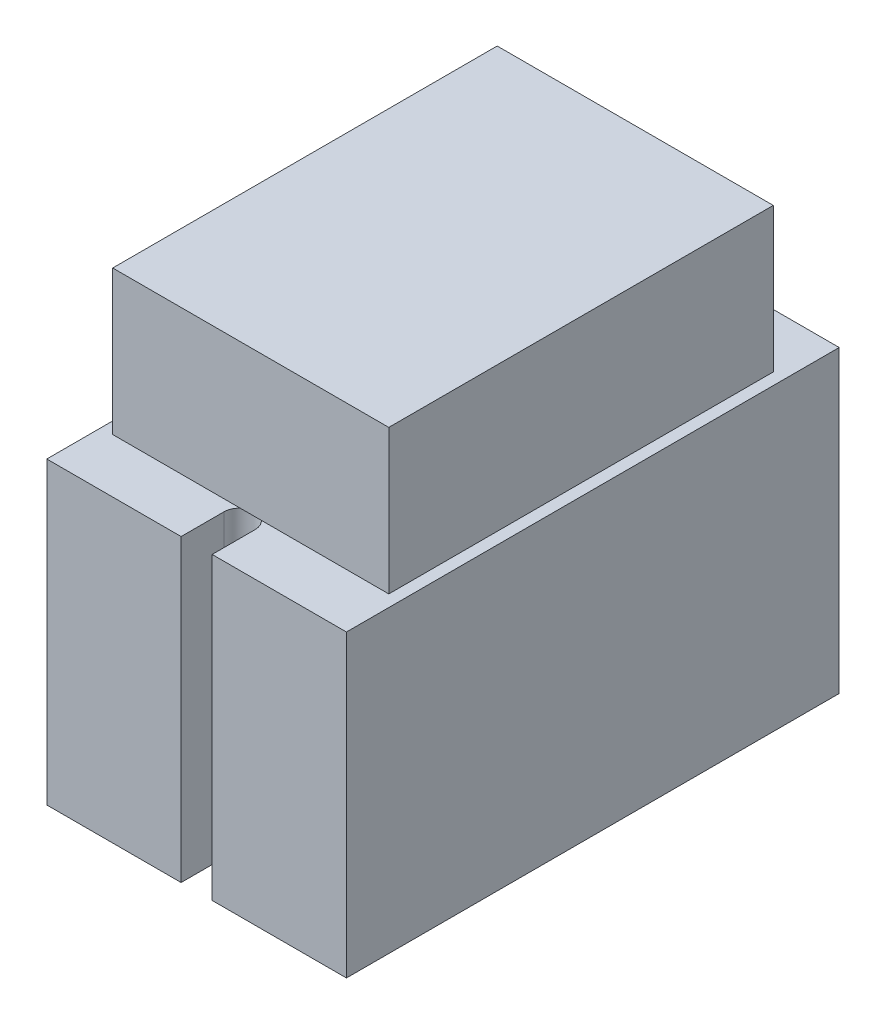
ISO-10303-21;
HEADER;
FILE_DESCRIPTION(('STEP AP214'),'2;1');
FILE_NAME('part.step','',(''),(''),'','','');
FILE_SCHEMA(('AUTOMOTIVE_DESIGN { 1 0 10303 214 1 1 1 1 }'));
ENDSEC;
DATA;
#1=APPLICATION_CONTEXT('core data for automotive mechanical design processes');
#2=APPLICATION_PROTOCOL_DEFINITION('international standard','automotive_design',2000,#1);
#3=PRODUCT_CONTEXT('',#1,'mechanical');
#4=PRODUCT('Part','Part','',(#3));
#5=PRODUCT_RELATED_PRODUCT_CATEGORY('part','',(#4));
#6=PRODUCT_DEFINITION_FORMATION('','',#4);
#7=PRODUCT_DEFINITION_CONTEXT('part definition',#1,'design');
#8=PRODUCT_DEFINITION('design','',#6,#7);
#9=PRODUCT_DEFINITION_SHAPE('','',#8);
#10=(LENGTH_UNIT() NAMED_UNIT(*) SI_UNIT(.MILLI.,.METRE.));
#11=(NAMED_UNIT(*) PLANE_ANGLE_UNIT() SI_UNIT($,.RADIAN.));
#12=(NAMED_UNIT(*) SI_UNIT($,.STERADIAN.) SOLID_ANGLE_UNIT());
#13=UNCERTAINTY_MEASURE_WITH_UNIT(LENGTH_MEASURE(1.E-05),#10,'distance_accuracy_value','');
#14=(GEOMETRIC_REPRESENTATION_CONTEXT(3) GLOBAL_UNCERTAINTY_ASSIGNED_CONTEXT((#13)) GLOBAL_UNIT_ASSIGNED_CONTEXT((#10,
#11,#12)) REPRESENTATION_CONTEXT('',''));
#15=CARTESIAN_POINT('',(0.,0.,0.));
#16=DIRECTION('',(0.,0.,1.));
#17=DIRECTION('',(1.,0.,0.));
#18=AXIS2_PLACEMENT_3D('',#15,#16,#17);
#19=CARTESIAN_POINT('',(0.,49.0728,0.));
#20=DIRECTION('',(0.,1.,0.));
#21=DIRECTION('',(0.,0.,1.));
#22=AXIS2_PLACEMENT_3D('',#19,#20,#21);
#23=PLANE('',#22);
#24=DIRECTION('',(1.,0.,0.));
#25=VECTOR('',#24,1.);
#26=CARTESIAN_POINT('',(1.9304,49.0728,-8.86459999999999));
#27=LINE('',#26,#25);
#28=CARTESIAN_POINT('',(26.2723557482839,49.0728,-8.86459999999999));
#29=VERTEX_POINT('',#28);
#30=CARTESIAN_POINT('',(47.1424,49.0728,-8.86459999999999));
#31=VERTEX_POINT('',#30);
#32=EDGE_CURVE('E11',#29,#31,#27,.T.);
#33=ORIENTED_EDGE('',*,*,#32,.F.);
#34=CARTESIAN_POINT('',(24.5364,49.0728,-7.0104));
#35=DIRECTION('',(0.,1.,0.));
#36=DIRECTION('',(0.,0.,1.));
#37=AXIS2_PLACEMENT_3D('',#34,#35,#36);
#38=CIRCLE('',#37,2.53999999999999);
#39=CARTESIAN_POINT('',(27.0764,49.0728,-7.0104));
#40=VERTEX_POINT('',#39);
#41=EDGE_CURVE('E193',#29,#40,#38,.F.);
#42=ORIENTED_EDGE('',*,*,#41,.T.);
#43=DIRECTION('',(0.,0.,1.));
#44=VECTOR('',#43,1.);
#45=CARTESIAN_POINT('',(27.0764,49.0728,0.));
#46=LINE('',#45,#44);
#47=CARTESIAN_POINT('',(27.0764,49.0728,0.));
#48=VERTEX_POINT('',#47);
#49=EDGE_CURVE('E198',#40,#48,#46,.T.);
#50=ORIENTED_EDGE('',*,*,#49,.T.);
#51=DIRECTION('',(1.,0.,0.));
#52=VECTOR('',#51,1.);
#53=CARTESIAN_POINT('',(0.,49.0728,0.));
#54=LINE('',#53,#52);
#55=CARTESIAN_POINT('',(49.0728,49.0728,0.));
#56=VERTEX_POINT('',#55);
#57=EDGE_CURVE('E201',#48,#56,#54,.T.);
#58=ORIENTED_EDGE('',*,*,#57,.T.);
#59=DIRECTION('',(0.,0.,-1.));
#60=VECTOR('',#59,1.);
#61=CARTESIAN_POINT('',(49.0728,49.0728,0.));
#62=LINE('',#61,#60);
#63=CARTESIAN_POINT('',(49.0728,49.0728,-80.6958));
#64=VERTEX_POINT('',#63);
#65=EDGE_CURVE('E203',#56,#64,#62,.T.);
#66=ORIENTED_EDGE('',*,*,#65,.T.);
#67=DIRECTION('',(1.,0.,0.));
#68=VECTOR('',#67,1.);
#69=CARTESIAN_POINT('',(0.,49.0728,-80.6958));
#70=LINE('',#69,#68);
#71=CARTESIAN_POINT('',(27.0764,49.0728,-80.6958));
#72=VERTEX_POINT('',#71);
#73=EDGE_CURVE('E206',#72,#64,#70,.T.);
#74=ORIENTED_EDGE('',*,*,#73,.F.);
#75=DIRECTION('',(0.,0.,-1.));
#76=VECTOR('',#75,1.);
#77=CARTESIAN_POINT('',(27.0764,49.0728,0.));
#78=LINE('',#77,#76);
#79=CARTESIAN_POINT('',(27.0764,49.0728,-73.6854));
#80=VERTEX_POINT('',#79);
#81=EDGE_CURVE('E209',#80,#72,#78,.T.);
#82=ORIENTED_EDGE('',*,*,#81,.F.);
#83=CARTESIAN_POINT('',(24.5364,49.0728,-73.6854));
#84=DIRECTION('',(0.,1.,0.));
#85=DIRECTION('',(0.,0.,1.));
#86=AXIS2_PLACEMENT_3D('',#83,#84,#85);
#87=CIRCLE('',#86,2.53999999999999);
#88=CARTESIAN_POINT('',(26.2723557482839,49.0728,-71.8312));
#89=VERTEX_POINT('',#88);
#90=EDGE_CURVE('E213',#89,#80,#87,.T.);
#91=ORIENTED_EDGE('',*,*,#90,.F.);
#92=DIRECTION('',(-1.,0.,0.));
#93=VECTOR('',#92,1.);
#94=CARTESIAN_POINT('',(1.93039999999999,49.0728,-71.8312));
#95=LINE('',#94,#93);
#96=CARTESIAN_POINT('',(47.1424,49.0728,-71.8312));
#97=VERTEX_POINT('',#96);
#98=EDGE_CURVE('E56',#97,#89,#95,.T.);
#99=ORIENTED_EDGE('',*,*,#98,.F.);
#100=DIRECTION('',(0.,0.,-1.));
#101=VECTOR('',#100,1.);
#102=CARTESIAN_POINT('',(47.1424,49.0728,-71.8312));
#103=LINE('',#102,#101);
#104=EDGE_CURVE('E52',#31,#97,#103,.T.);
#105=ORIENTED_EDGE('',*,*,#104,.F.);
#106=EDGE_LOOP('',(#33,#42,#50,#58,#66,#74,#82,#91,#99,#105));
#107=FACE_BOUND('',#106,.T.);
#108=ADVANCED_FACE('F33',(#107),#23,.T.);
#109=CARTESIAN_POINT('',(21.9964,49.0728,0.));
#110=DIRECTION('',(1.,0.,0.));
#111=DIRECTION('',(0.,0.,-1.));
#112=AXIS2_PLACEMENT_3D('',#109,#110,#111);
#113=PLANE('',#112);
#114=DIRECTION('',(0.,0.,1.));
#115=VECTOR('',#114,1.);
#116=CARTESIAN_POINT('',(21.9964,0.,0.));
#117=LINE('',#116,#115);
#118=CARTESIAN_POINT('',(21.9964,0.,-7.0104));
#119=VERTEX_POINT('',#118);
#120=CARTESIAN_POINT('',(21.9964,0.,0.));
#121=VERTEX_POINT('',#120);
#122=EDGE_CURVE('E181',#119,#121,#117,.T.);
#123=ORIENTED_EDGE('',*,*,#122,.F.);
#124=DIRECTION('',(0.,-1.,0.));
#125=VECTOR('',#124,1.);
#126=CARTESIAN_POINT('',(21.9964,49.0728,-7.0104));
#127=LINE('',#126,#125);
#128=CARTESIAN_POINT('',(21.9964,49.0728,-7.0104));
#129=VERTEX_POINT('',#128);
#130=EDGE_CURVE('E37',#129,#119,#127,.T.);
#131=ORIENTED_EDGE('',*,*,#130,.F.);
#132=DIRECTION('',(0.,0.,1.));
#133=VECTOR('',#132,1.);
#134=CARTESIAN_POINT('',(21.9964,49.0728,0.));
#135=LINE('',#134,#133);
#136=CARTESIAN_POINT('',(21.9964,49.0728,0.));
#137=VERTEX_POINT('',#136);
#138=EDGE_CURVE('E190',#129,#137,#135,.T.);
#139=ORIENTED_EDGE('',*,*,#138,.T.);
#140=DIRECTION('',(0.,-1.,0.));
#141=VECTOR('',#140,1.);
#142=CARTESIAN_POINT('',(21.9964,49.0728,0.));
#143=LINE('',#142,#141);
#144=EDGE_CURVE('E247',#137,#121,#143,.T.);
#145=ORIENTED_EDGE('',*,*,#144,.T.);
#146=EDGE_LOOP('',(#123,#131,#139,#145));
#147=FACE_BOUND('',#146,.T.);
#148=ADVANCED_FACE('F35',(#147),#113,.T.);
#149=CARTESIAN_POINT('',(24.5364,49.0728,-7.0104));
#150=DIRECTION('',(0.,-1.,0.));
#151=DIRECTION('',(0.,0.,-1.));
#152=AXIS2_PLACEMENT_3D('',#149,#150,#151);
#153=CYLINDRICAL_SURFACE('',#152,2.53999999999999);
#154=CARTESIAN_POINT('',(24.5364,0.,-7.0104));
#155=DIRECTION('',(0.,1.,0.));
#156=DIRECTION('',(0.,0.,1.));
#157=AXIS2_PLACEMENT_3D('',#154,#155,#156);
#158=CIRCLE('',#157,2.53999999999999);
#159=CARTESIAN_POINT('',(27.0764,0.,-7.0104));
#160=VERTEX_POINT('',#159);
#161=EDGE_CURVE('E184',#119,#160,#158,.F.);
#162=ORIENTED_EDGE('',*,*,#161,.T.);
#163=DIRECTION('',(0.,-1.,0.));
#164=VECTOR('',#163,1.);
#165=CARTESIAN_POINT('',(27.0764,49.0728,-7.0104));
#166=LINE('',#165,#164);
#167=EDGE_CURVE('E268',#40,#160,#166,.T.);
#168=ORIENTED_EDGE('',*,*,#167,.F.);
#169=ORIENTED_EDGE('',*,*,#41,.F.);
#170=CARTESIAN_POINT('',(22.8004442517161,49.0728,-8.86459999999999));
#171=VERTEX_POINT('',#170);
#172=EDGE_CURVE('E199',#171,#29,#38,.F.);
#173=ORIENTED_EDGE('',*,*,#172,.F.);
#174=EDGE_CURVE('E195',#129,#171,#38,.F.);
#175=ORIENTED_EDGE('',*,*,#174,.F.);
#176=ORIENTED_EDGE('',*,*,#130,.T.);
#177=EDGE_LOOP('',(#162,#168,#169,#173,#175,#176));
#178=FACE_BOUND('',#177,.T.);
#179=ADVANCED_FACE('F303',(#178),#153,.F.);
#180=CARTESIAN_POINT('',(27.0764,49.0728,0.));
#181=DIRECTION('',(1.,0.,0.));
#182=DIRECTION('',(0.,0.,-1.));
#183=AXIS2_PLACEMENT_3D('',#180,#181,#182);
#184=PLANE('',#183);
#185=DIRECTION('',(0.,0.,1.));
#186=VECTOR('',#185,1.);
#187=CARTESIAN_POINT('',(27.0764,0.,0.));
#188=LINE('',#187,#186);
#189=CARTESIAN_POINT('',(27.0764,0.,0.));
#190=VERTEX_POINT('',#189);
#191=EDGE_CURVE('E224',#160,#190,#188,.T.);
#192=ORIENTED_EDGE('',*,*,#191,.T.);
#193=DIRECTION('',(0.,-1.,0.));
#194=VECTOR('',#193,1.);
#195=CARTESIAN_POINT('',(27.0764,49.0728,0.));
#196=LINE('',#195,#194);
#197=EDGE_CURVE('E266',#48,#190,#196,.T.);
#198=ORIENTED_EDGE('',*,*,#197,.F.);
#199=ORIENTED_EDGE('',*,*,#49,.F.);
#200=ORIENTED_EDGE('',*,*,#167,.T.);
#201=EDGE_LOOP('',(#192,#198,#199,#200));
#202=FACE_BOUND('',#201,.T.);
#203=ADVANCED_FACE('F304',(#202),#184,.F.);
#204=CARTESIAN_POINT('',(0.,49.0728,0.));
#205=DIRECTION('',(0.,0.,-1.));
#206=DIRECTION('',(-1.,0.,0.));
#207=AXIS2_PLACEMENT_3D('',#204,#205,#206);
#208=PLANE('',#207);
#209=DIRECTION('',(1.,0.,0.));
#210=VECTOR('',#209,1.);
#211=CARTESIAN_POINT('',(0.,0.,0.));
#212=LINE('',#211,#210);
#213=CARTESIAN_POINT('',(49.0728,0.,0.));
#214=VERTEX_POINT('',#213);
#215=EDGE_CURVE('E226',#190,#214,#212,.T.);
#216=ORIENTED_EDGE('',*,*,#215,.T.);
#217=DIRECTION('',(0.,-1.,0.));
#218=VECTOR('',#217,1.);
#219=CARTESIAN_POINT('',(49.0728,49.0728,0.));
#220=LINE('',#219,#218);
#221=EDGE_CURVE('E263',#56,#214,#220,.T.);
#222=ORIENTED_EDGE('',*,*,#221,.F.);
#223=ORIENTED_EDGE('',*,*,#57,.F.);
#224=ORIENTED_EDGE('',*,*,#197,.T.);
#225=EDGE_LOOP('',(#216,#222,#223,#224));
#226=FACE_BOUND('',#225,.T.);
#227=ADVANCED_FACE('F309',(#226),#208,.F.);
#228=CARTESIAN_POINT('',(49.0728,49.0728,0.));
#229=DIRECTION('',(-1.,0.,0.));
#230=DIRECTION('',(0.,0.,1.));
#231=AXIS2_PLACEMENT_3D('',#228,#229,#230);
#232=PLANE('',#231);
#233=DIRECTION('',(0.,0.,-1.));
#234=VECTOR('',#233,1.);
#235=CARTESIAN_POINT('',(49.0728,0.,0.));
#236=LINE('',#235,#234);
#237=CARTESIAN_POINT('',(49.0728,0.,-80.6958));
#238=VERTEX_POINT('',#237);
#239=EDGE_CURVE('E228',#214,#238,#236,.T.);
#240=ORIENTED_EDGE('',*,*,#239,.T.);
#241=DIRECTION('',(0.,-1.,0.));
#242=VECTOR('',#241,1.);
#243=CARTESIAN_POINT('',(49.0728,49.0728,-80.6958));
#244=LINE('',#243,#242);
#245=EDGE_CURVE('E261',#64,#238,#244,.T.);
#246=ORIENTED_EDGE('',*,*,#245,.F.);
#247=ORIENTED_EDGE('',*,*,#65,.F.);
#248=ORIENTED_EDGE('',*,*,#221,.T.);
#249=EDGE_LOOP('',(#240,#246,#247,#248));
#250=FACE_BOUND('',#249,.T.);
#251=ADVANCED_FACE('F315',(#250),#232,.F.);
#252=CARTESIAN_POINT('',(0.,49.0728,-80.6958));
#253=DIRECTION('',(0.,0.,-1.));
#254=DIRECTION('',(-1.,0.,0.));
#255=AXIS2_PLACEMENT_3D('',#252,#253,#254);
#256=PLANE('',#255);
#257=DIRECTION('',(1.,0.,0.));
#258=VECTOR('',#257,1.);
#259=CARTESIAN_POINT('',(0.,0.,-80.6958));
#260=LINE('',#259,#258);
#261=CARTESIAN_POINT('',(27.0764,0.,-80.6958));
#262=VERTEX_POINT('',#261);
#263=EDGE_CURVE('E231',#262,#238,#260,.T.);
#264=ORIENTED_EDGE('',*,*,#263,.F.);
#265=DIRECTION('',(0.,-1.,0.));
#266=VECTOR('',#265,1.);
#267=CARTESIAN_POINT('',(27.0764,49.0728,-80.6958));
#268=LINE('',#267,#266);
#269=EDGE_CURVE('E259',#72,#262,#268,.T.);
#270=ORIENTED_EDGE('',*,*,#269,.F.);
#271=ORIENTED_EDGE('',*,*,#73,.T.);
#272=ORIENTED_EDGE('',*,*,#245,.T.);
#273=EDGE_LOOP('',(#264,#270,#271,#272));
#274=FACE_BOUND('',#273,.T.);
#275=ADVANCED_FACE('F319',(#274),#256,.T.);
#276=CARTESIAN_POINT('',(27.0764,49.0728,0.));
#277=DIRECTION('',(-1.,0.,0.));
#278=DIRECTION('',(0.,0.,1.));
#279=AXIS2_PLACEMENT_3D('',#276,#277,#278);
#280=PLANE('',#279);
#281=DIRECTION('',(0.,0.,-1.));
#282=VECTOR('',#281,1.);
#283=CARTESIAN_POINT('',(27.0764,0.,0.));
#284=LINE('',#283,#282);
#285=CARTESIAN_POINT('',(27.0764,0.,-73.6854));
#286=VERTEX_POINT('',#285);
#287=EDGE_CURVE('E234',#286,#262,#284,.T.);
#288=ORIENTED_EDGE('',*,*,#287,.F.);
#289=DIRECTION('',(0.,-1.,0.));
#290=VECTOR('',#289,1.);
#291=CARTESIAN_POINT('',(27.0764,49.0728,-73.6854));
#292=LINE('',#291,#290);
#293=EDGE_CURVE('E257',#80,#286,#292,.T.);
#294=ORIENTED_EDGE('',*,*,#293,.F.);
#295=ORIENTED_EDGE('',*,*,#81,.T.);
#296=ORIENTED_EDGE('',*,*,#269,.T.);
#297=EDGE_LOOP('',(#288,#294,#295,#296));
#298=FACE_BOUND('',#297,.T.);
#299=ADVANCED_FACE('F322',(#298),#280,.T.);
#300=CARTESIAN_POINT('',(24.5364,49.0728,-73.6854));
#301=DIRECTION('',(0.,-1.,0.));
#302=DIRECTION('',(0.,0.,-1.));
#303=AXIS2_PLACEMENT_3D('',#300,#301,#302);
#304=CYLINDRICAL_SURFACE('',#303,2.53999999999999);
#305=CARTESIAN_POINT('',(24.5364,0.,-73.6854));
#306=DIRECTION('',(0.,1.,0.));
#307=DIRECTION('',(0.,0.,1.));
#308=AXIS2_PLACEMENT_3D('',#305,#306,#307);
#309=CIRCLE('',#308,2.53999999999999);
#310=CARTESIAN_POINT('',(21.9964,0.,-73.6854));
#311=VERTEX_POINT('',#310);
#312=EDGE_CURVE('E238',#311,#286,#309,.T.);
#313=ORIENTED_EDGE('',*,*,#312,.F.);
#314=DIRECTION('',(0.,-1.,0.));
#315=VECTOR('',#314,1.);
#316=CARTESIAN_POINT('',(21.9964,49.0728,-73.6854));
#317=LINE('',#316,#315);
#318=CARTESIAN_POINT('',(21.9964,49.0728,-73.6854));
#319=VERTEX_POINT('',#318);
#320=EDGE_CURVE('E255',#319,#311,#317,.T.);
#321=ORIENTED_EDGE('',*,*,#320,.F.);
#322=CARTESIAN_POINT('',(22.8004442517161,49.0728,-71.8312));
#323=VERTEX_POINT('',#322);
#324=EDGE_CURVE('E214',#319,#323,#87,.T.);
#325=ORIENTED_EDGE('',*,*,#324,.T.);
#326=EDGE_CURVE('E218',#323,#89,#87,.T.);
#327=ORIENTED_EDGE('',*,*,#326,.T.);
#328=ORIENTED_EDGE('',*,*,#90,.T.);
#329=ORIENTED_EDGE('',*,*,#293,.T.);
#330=EDGE_LOOP('',(#313,#321,#325,#327,#328,#329));
#331=FACE_BOUND('',#330,.T.);
#332=ADVANCED_FACE('F328',(#331),#304,.F.);
#333=CARTESIAN_POINT('',(21.9964,49.0728,0.));
#334=DIRECTION('',(-1.,0.,0.));
#335=DIRECTION('',(0.,0.,1.));
#336=AXIS2_PLACEMENT_3D('',#333,#334,#335);
#337=PLANE('',#336);
#338=DIRECTION('',(0.,0.,-1.));
#339=VECTOR('',#338,1.);
#340=CARTESIAN_POINT('',(21.9964,0.,0.));
#341=LINE('',#340,#339);
#342=CARTESIAN_POINT('',(21.9964,0.,-80.6958));
#343=VERTEX_POINT('',#342);
#344=EDGE_CURVE('E241',#311,#343,#341,.T.);
#345=ORIENTED_EDGE('',*,*,#344,.T.);
#346=DIRECTION('',(0.,-1.,0.));
#347=VECTOR('',#346,1.);
#348=CARTESIAN_POINT('',(21.9964,49.0728,-80.6958));
#349=LINE('',#348,#347);
#350=CARTESIAN_POINT('',(21.9964,49.0728,-80.6958));
#351=VERTEX_POINT('',#350);
#352=EDGE_CURVE('E253',#351,#343,#349,.T.);
#353=ORIENTED_EDGE('',*,*,#352,.F.);
#354=DIRECTION('',(0.,0.,-1.));
#355=VECTOR('',#354,1.);
#356=CARTESIAN_POINT('',(21.9964,49.0728,0.));
#357=LINE('',#356,#355);
#358=EDGE_CURVE('E217',#319,#351,#357,.T.);
#359=ORIENTED_EDGE('',*,*,#358,.F.);
#360=ORIENTED_EDGE('',*,*,#320,.T.);
#361=EDGE_LOOP('',(#345,#353,#359,#360));
#362=FACE_BOUND('',#361,.T.);
#363=ADVANCED_FACE('F374',(#362),#337,.F.);
#364=CARTESIAN_POINT('',(0.,0.,-80.6958));
#365=VERTEX_POINT('',#364);
#366=EDGE_CURVE('E235',#365,#343,#260,.T.);
#367=ORIENTED_EDGE('',*,*,#366,.F.);
#368=DIRECTION('',(0.,-1.,0.));
#369=VECTOR('',#368,1.);
#370=CARTESIAN_POINT('',(0.,49.0728,-80.6958));
#371=LINE('',#370,#369);
#372=CARTESIAN_POINT('',(0.,49.0728,-80.6958));
#373=VERTEX_POINT('',#372);
#374=EDGE_CURVE('E251',#373,#365,#371,.T.);
#375=ORIENTED_EDGE('',*,*,#374,.F.);
#376=EDGE_CURVE('E210',#373,#351,#70,.T.);
#377=ORIENTED_EDGE('',*,*,#376,.T.);
#378=ORIENTED_EDGE('',*,*,#352,.T.);
#379=EDGE_LOOP('',(#367,#375,#377,#378));
#380=FACE_BOUND('',#379,.T.);
#381=ADVANCED_FACE('F380',(#380),#256,.T.);
#382=CARTESIAN_POINT('',(0.,49.0728,0.));
#383=DIRECTION('',(-1.,0.,0.));
#384=DIRECTION('',(0.,0.,1.));
#385=AXIS2_PLACEMENT_3D('',#382,#383,#384);
#386=PLANE('',#385);
#387=DIRECTION('',(0.,0.,-1.));
#388=VECTOR('',#387,1.);
#389=CARTESIAN_POINT('',(0.,0.,0.));
#390=LINE('',#389,#388);
#391=CARTESIAN_POINT('',(0.,0.,0.));
#392=VERTEX_POINT('',#391);
#393=EDGE_CURVE('E244',#392,#365,#390,.T.);
#394=ORIENTED_EDGE('',*,*,#393,.F.);
#395=DIRECTION('',(0.,-1.,0.));
#396=VECTOR('',#395,1.);
#397=CARTESIAN_POINT('',(0.,49.0728,0.));
#398=LINE('',#397,#396);
#399=CARTESIAN_POINT('',(0.,49.0728,0.));
#400=VERTEX_POINT('',#399);
#401=EDGE_CURVE('E249',#400,#392,#398,.T.);
#402=ORIENTED_EDGE('',*,*,#401,.F.);
#403=DIRECTION('',(0.,0.,-1.));
#404=VECTOR('',#403,1.);
#405=CARTESIAN_POINT('',(0.,49.0728,0.));
#406=LINE('',#405,#404);
#407=EDGE_CURVE('E220',#400,#373,#406,.T.);
#408=ORIENTED_EDGE('',*,*,#407,.T.);
#409=ORIENTED_EDGE('',*,*,#374,.T.);
#410=EDGE_LOOP('',(#394,#402,#408,#409));
#411=FACE_BOUND('',#410,.T.);
#412=ADVANCED_FACE('F358',(#411),#386,.T.);
#413=EDGE_CURVE('E194',#392,#121,#212,.T.);
#414=ORIENTED_EDGE('',*,*,#413,.T.);
#415=ORIENTED_EDGE('',*,*,#144,.F.);
#416=EDGE_CURVE('E204',#400,#137,#54,.T.);
#417=ORIENTED_EDGE('',*,*,#416,.F.);
#418=ORIENTED_EDGE('',*,*,#401,.T.);
#419=EDGE_LOOP('',(#414,#415,#417,#418));
#420=FACE_BOUND('',#419,.T.);
#421=ADVANCED_FACE('F351',(#420),#208,.F.);
#422=CARTESIAN_POINT('',(1.9304,49.0728,-8.86459999999999));
#423=VERTEX_POINT('',#422);
#424=EDGE_CURVE('E44',#423,#171,#27,.T.);
#425=ORIENTED_EDGE('',*,*,#424,.F.);
#426=DIRECTION('',(0.,0.,1.));
#427=VECTOR('',#426,1.);
#428=CARTESIAN_POINT('',(1.93039999999999,49.0728,-71.8312));
#429=LINE('',#428,#427);
#430=CARTESIAN_POINT('',(1.93039999999999,49.0728,-71.8312));
#431=VERTEX_POINT('',#430);
#432=EDGE_CURVE('E282',#431,#423,#429,.T.);
#433=ORIENTED_EDGE('',*,*,#432,.F.);
#434=EDGE_CURVE('E42',#323,#431,#95,.T.);
#435=ORIENTED_EDGE('',*,*,#434,.F.);
#436=ORIENTED_EDGE('',*,*,#324,.F.);
#437=ORIENTED_EDGE('',*,*,#358,.T.);
#438=ORIENTED_EDGE('',*,*,#376,.F.);
#439=ORIENTED_EDGE('',*,*,#407,.F.);
#440=ORIENTED_EDGE('',*,*,#416,.T.);
#441=ORIENTED_EDGE('',*,*,#138,.F.);
#442=ORIENTED_EDGE('',*,*,#174,.T.);
#443=EDGE_LOOP('',(#425,#433,#435,#436,#437,#438,#439,#440,#441,#442));
#444=FACE_BOUND('',#443,.T.);
#445=ADVANCED_FACE('F343',(#444),#23,.T.);
#446=CARTESIAN_POINT('',(0.,0.,0.));
#447=DIRECTION('',(0.,1.,0.));
#448=DIRECTION('',(0.,0.,1.));
#449=AXIS2_PLACEMENT_3D('',#446,#447,#448);
#450=PLANE('',#449);
#451=ORIENTED_EDGE('',*,*,#122,.T.);
#452=ORIENTED_EDGE('',*,*,#413,.F.);
#453=ORIENTED_EDGE('',*,*,#393,.T.);
#454=ORIENTED_EDGE('',*,*,#366,.T.);
#455=ORIENTED_EDGE('',*,*,#344,.F.);
#456=ORIENTED_EDGE('',*,*,#312,.T.);
#457=ORIENTED_EDGE('',*,*,#287,.T.);
#458=ORIENTED_EDGE('',*,*,#263,.T.);
#459=ORIENTED_EDGE('',*,*,#239,.F.);
#460=ORIENTED_EDGE('',*,*,#215,.F.);
#461=ORIENTED_EDGE('',*,*,#191,.F.);
#462=ORIENTED_EDGE('',*,*,#161,.F.);
#463=EDGE_LOOP('',(#451,#452,#453,#454,#455,#456,#457,#458,#459,#460,#461,#462));
#464=FACE_BOUND('',#463,.T.);
#465=ADVANCED_FACE('F340',(#464),#450,.F.);
#466=CARTESIAN_POINT('',(0.,49.0728,0.));
#467=DIRECTION('',(0.,1.,0.));
#468=DIRECTION('',(0.,0.,1.));
#469=AXIS2_PLACEMENT_3D('',#466,#467,#468);
#470=PLANE('',#469);
#471=EDGE_CURVE('E45',#171,#29,#27,.T.);
#472=ORIENTED_EDGE('',*,*,#471,.F.);
#473=ORIENTED_EDGE('',*,*,#172,.T.);
#474=EDGE_LOOP('',(#472,#473));
#475=FACE_BOUND('',#474,.T.);
#476=ADVANCED_FACE('F300',(#475),#470,.F.);
#477=CARTESIAN_POINT('',(47.1424,72.6948,-71.8312));
#478=DIRECTION('',(-1.,0.,0.));
#479=DIRECTION('',(0.,0.,1.));
#480=AXIS2_PLACEMENT_3D('',#477,#478,#479);
#481=PLANE('',#480);
#482=ORIENTED_EDGE('',*,*,#104,.T.);
#483=DIRECTION('',(0.,-1.,0.));
#484=VECTOR('',#483,1.);
#485=CARTESIAN_POINT('',(47.1424,72.6948,-71.8312));
#486=LINE('',#485,#484);
#487=CARTESIAN_POINT('',(47.1424,72.6948,-71.8312));
#488=VERTEX_POINT('',#487);
#489=EDGE_CURVE('E163',#488,#97,#486,.T.);
#490=ORIENTED_EDGE('',*,*,#489,.F.);
#491=DIRECTION('',(0.,0.,-1.));
#492=VECTOR('',#491,1.);
#493=CARTESIAN_POINT('',(47.1424,72.6948,-71.8312));
#494=LINE('',#493,#492);
#495=CARTESIAN_POINT('',(47.1424,72.6948,-8.86459999999999));
#496=VERTEX_POINT('',#495);
#497=EDGE_CURVE('E170',#496,#488,#494,.T.);
#498=ORIENTED_EDGE('',*,*,#497,.F.);
#499=DIRECTION('',(0.,-1.,0.));
#500=VECTOR('',#499,1.);
#501=CARTESIAN_POINT('',(47.1424,72.6948,-8.86459999999999));
#502=LINE('',#501,#500);
#503=EDGE_CURVE('E286',#496,#31,#502,.T.);
#504=ORIENTED_EDGE('',*,*,#503,.T.);
#505=EDGE_LOOP('',(#482,#490,#498,#504));
#506=FACE_BOUND('',#505,.T.);
#507=ADVANCED_FACE('F180',(#506),#481,.F.);
#508=CARTESIAN_POINT('',(1.93039999999999,72.6948,-71.8312));
#509=DIRECTION('',(0.,0.,1.));
#510=DIRECTION('',(1.,0.,0.));
#511=AXIS2_PLACEMENT_3D('',#508,#509,#510);
#512=PLANE('',#511);
#513=ORIENTED_EDGE('',*,*,#98,.T.);
#514=EDGE_CURVE('E278',#89,#323,#95,.T.);
#515=ORIENTED_EDGE('',*,*,#514,.T.);
#516=ORIENTED_EDGE('',*,*,#434,.T.);
#517=DIRECTION('',(0.,-1.,0.));
#518=VECTOR('',#517,1.);
#519=CARTESIAN_POINT('',(1.93039999999999,72.6948,-71.8312));
#520=LINE('',#519,#518);
#521=CARTESIAN_POINT('',(1.93039999999999,72.6948,-71.8312));
#522=VERTEX_POINT('',#521);
#523=EDGE_CURVE('E166',#522,#431,#520,.T.);
#524=ORIENTED_EDGE('',*,*,#523,.F.);
#525=DIRECTION('',(-1.,0.,0.));
#526=VECTOR('',#525,1.);
#527=CARTESIAN_POINT('',(1.93039999999999,72.6948,-71.8312));
#528=LINE('',#527,#526);
#529=EDGE_CURVE('E159',#488,#522,#528,.T.);
#530=ORIENTED_EDGE('',*,*,#529,.F.);
#531=ORIENTED_EDGE('',*,*,#489,.T.);
#532=EDGE_LOOP('',(#513,#515,#516,#524,#530,#531));
#533=FACE_BOUND('',#532,.T.);
#534=ADVANCED_FACE('F161',(#533),#512,.F.);
#535=CARTESIAN_POINT('',(1.93039999999999,72.6948,-71.8312));
#536=DIRECTION('',(1.,0.,0.));
#537=DIRECTION('',(0.,0.,-1.));
#538=AXIS2_PLACEMENT_3D('',#535,#536,#537);
#539=PLANE('',#538);
#540=ORIENTED_EDGE('',*,*,#432,.T.);
#541=DIRECTION('',(0.,-1.,0.));
#542=VECTOR('',#541,1.);
#543=CARTESIAN_POINT('',(1.9304,72.6948,-8.86459999999999));
#544=LINE('',#543,#542);
#545=CARTESIAN_POINT('',(1.9304,72.6948,-8.86459999999999));
#546=VERTEX_POINT('',#545);
#547=EDGE_CURVE('E186',#546,#423,#544,.T.);
#548=ORIENTED_EDGE('',*,*,#547,.F.);
#549=DIRECTION('',(0.,0.,1.));
#550=VECTOR('',#549,1.);
#551=CARTESIAN_POINT('',(1.93039999999999,72.6948,-71.8312));
#552=LINE('',#551,#550);
#553=EDGE_CURVE('E169',#522,#546,#552,.T.);
#554=ORIENTED_EDGE('',*,*,#553,.F.);
#555=ORIENTED_EDGE('',*,*,#523,.T.);
#556=EDGE_LOOP('',(#540,#548,#554,#555));
#557=FACE_BOUND('',#556,.T.);
#558=ADVANCED_FACE('F291',(#557),#539,.F.);
#559=CARTESIAN_POINT('',(1.9304,72.6948,-8.86459999999999));
#560=DIRECTION('',(0.,0.,-1.));
#561=DIRECTION('',(-1.,0.,0.));
#562=AXIS2_PLACEMENT_3D('',#559,#560,#561);
#563=PLANE('',#562);
#564=ORIENTED_EDGE('',*,*,#424,.T.);
#565=ORIENTED_EDGE('',*,*,#471,.T.);
#566=ORIENTED_EDGE('',*,*,#32,.T.);
#567=ORIENTED_EDGE('',*,*,#503,.F.);
#568=DIRECTION('',(1.,0.,0.));
#569=VECTOR('',#568,1.);
#570=CARTESIAN_POINT('',(1.9304,72.6948,-8.86459999999999));
#571=LINE('',#570,#569);
#572=EDGE_CURVE('E175',#546,#496,#571,.T.);
#573=ORIENTED_EDGE('',*,*,#572,.F.);
#574=ORIENTED_EDGE('',*,*,#547,.T.);
#575=EDGE_LOOP('',(#564,#565,#566,#567,#573,#574));
#576=FACE_BOUND('',#575,.T.);
#577=ADVANCED_FACE('F294',(#576),#563,.F.);
#578=CARTESIAN_POINT('',(0.,72.6948,0.));
#579=DIRECTION('',(0.,1.,0.));
#580=DIRECTION('',(0.,0.,1.));
#581=AXIS2_PLACEMENT_3D('',#578,#579,#580);
#582=PLANE('',#581);
#583=ORIENTED_EDGE('',*,*,#497,.T.);
#584=ORIENTED_EDGE('',*,*,#529,.T.);
#585=ORIENTED_EDGE('',*,*,#553,.T.);
#586=ORIENTED_EDGE('',*,*,#572,.T.);
#587=EDGE_LOOP('',(#583,#584,#585,#586));
#588=FACE_BOUND('',#587,.T.);
#589=ADVANCED_FACE('F173',(#588),#582,.T.);
#590=ORIENTED_EDGE('',*,*,#326,.F.);
#591=ORIENTED_EDGE('',*,*,#514,.F.);
#592=EDGE_LOOP('',(#590,#591));
#593=FACE_BOUND('',#592,.T.);
#594=ADVANCED_FACE('F331',(#593),#470,.F.);
#595=CLOSED_SHELL('',(#108,#148,#179,#203,#227,#251,#275,#299,#332,#363,#381,#412,#421,#445,
#465,#476,#507,#534,#558,#577,#589,#594));
#596=MANIFOLD_SOLID_BREP('B2',#595);
#597=ADVANCED_BREP_SHAPE_REPRESENTATION('',(#18,#596),#14);
#598=SHAPE_DEFINITION_REPRESENTATION(#9,#597);
ENDSEC;
END-ISO-10303-21;
